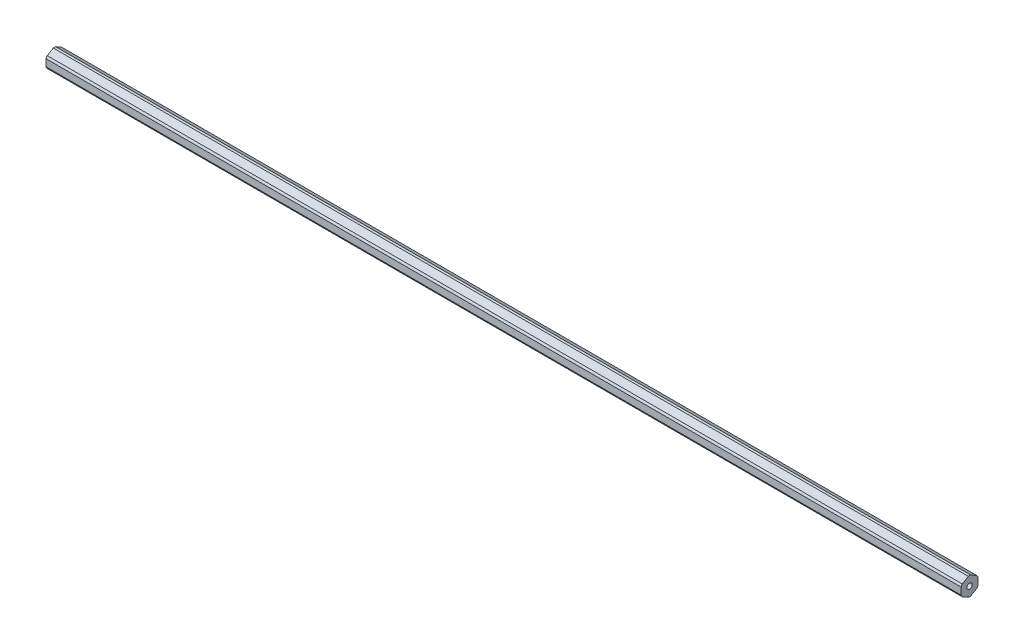
ISO-10303-21;
HEADER;
FILE_DESCRIPTION(('STEP AP214'),'2;1');
FILE_NAME('part.step','',(''),(''),'','','');
FILE_SCHEMA(('AUTOMOTIVE_DESIGN { 1 0 10303 214 1 1 1 1 }'));
ENDSEC;
DATA;
#1=APPLICATION_CONTEXT('core data for automotive mechanical design processes');
#2=APPLICATION_PROTOCOL_DEFINITION('international standard','automotive_design',2000,#1);
#3=PRODUCT_CONTEXT('',#1,'mechanical');
#4=PRODUCT('Part','Part','',(#3));
#5=PRODUCT_RELATED_PRODUCT_CATEGORY('part','',(#4));
#6=PRODUCT_DEFINITION_FORMATION('','',#4);
#7=PRODUCT_DEFINITION_CONTEXT('part definition',#1,'design');
#8=PRODUCT_DEFINITION('design','',#6,#7);
#9=PRODUCT_DEFINITION_SHAPE('','',#8);
#10=(LENGTH_UNIT() NAMED_UNIT(*) SI_UNIT(.MILLI.,.METRE.));
#11=(NAMED_UNIT(*) PLANE_ANGLE_UNIT() SI_UNIT($,.RADIAN.));
#12=(NAMED_UNIT(*) SI_UNIT($,.STERADIAN.) SOLID_ANGLE_UNIT());
#13=UNCERTAINTY_MEASURE_WITH_UNIT(LENGTH_MEASURE(1.E-05),#10,'distance_accuracy_value','');
#14=(GEOMETRIC_REPRESENTATION_CONTEXT(3) GLOBAL_UNCERTAINTY_ASSIGNED_CONTEXT((#13)) GLOBAL_UNIT_ASSIGNED_CONTEXT((#10,
#11,#12)) REPRESENTATION_CONTEXT('',''));
#15=CARTESIAN_POINT('',(0.,0.,0.));
#16=DIRECTION('',(0.,0.,1.));
#17=DIRECTION('',(1.,0.,0.));
#18=AXIS2_PLACEMENT_3D('',#15,#16,#17);
#19=CARTESIAN_POINT('',(342.9,-42.7410300776049,511.175273482722));
#20=DIRECTION('',(0.,-0.866025403784439,0.5));
#21=DIRECTION('',(0.,-0.5,-0.866025403784439));
#22=AXIS2_PLACEMENT_3D('',#19,#20,#21);
#23=PLANE('',#22);
#24=DIRECTION('',(0.,0.5,0.866025403784439));
#25=VECTOR('',#24,1.);
#26=CARTESIAN_POINT('',(342.9,-42.7410300776049,511.175273482722));
#27=LINE('',#26,#25);
#28=CARTESIAN_POINT('',(342.9,-44.0578613347996,508.894454840266));
#29=VERTEX_POINT('',#28);
#30=CARTESIAN_POINT('',(342.9,-41.4241988204102,513.456092125178));
#31=VERTEX_POINT('',#30);
#32=EDGE_CURVE('E192',#29,#31,#27,.T.);
#33=ORIENTED_EDGE('',*,*,#32,.T.);
#34=DIRECTION('',(-1.,0.,0.));
#35=VECTOR('',#34,1.);
#36=CARTESIAN_POINT('',(342.9,-41.4241988204102,513.456092125178));
#37=LINE('',#36,#35);
#38=CARTESIAN_POINT('',(-342.9,-41.42419882041,513.456092125178));
#39=VERTEX_POINT('',#38);
#40=EDGE_CURVE('E185',#31,#39,#37,.T.);
#41=ORIENTED_EDGE('',*,*,#40,.T.);
#42=DIRECTION('',(0.,-0.5,-0.866025403784438));
#43=VECTOR('',#42,1.);
#44=CARTESIAN_POINT('',(-342.9,-42.7410300776047,511.175273482722));
#45=LINE('',#44,#43);
#46=CARTESIAN_POINT('',(-342.9,-44.0578613347994,508.894454840266));
#47=VERTEX_POINT('',#46);
#48=EDGE_CURVE('E139',#39,#47,#45,.T.);
#49=ORIENTED_EDGE('',*,*,#48,.T.);
#50=DIRECTION('',(-1.,0.,0.));
#51=VECTOR('',#50,1.);
#52=CARTESIAN_POINT('',(342.9,-44.0578613347996,508.894454840266));
#53=LINE('',#52,#51);
#54=EDGE_CURVE('E181',#47,#29,#53,.F.);
#55=ORIENTED_EDGE('',*,*,#54,.T.);
#56=EDGE_LOOP('',(#33,#41,#49,#55));
#57=FACE_BOUND('',#56,.T.);
#58=ADVANCED_FACE('F17',(#57),#23,.T.);
#59=CARTESIAN_POINT('',(342.9,-37.2412950776049,514.350546965443));
#60=DIRECTION('',(0.,0.,1.));
#61=DIRECTION('',(1.,0.,0.));
#62=AXIS2_PLACEMENT_3D('',#59,#60,#61);
#63=PLANE('',#62);
#64=DIRECTION('',(0.,1.,0.));
#65=VECTOR('',#64,1.);
#66=CARTESIAN_POINT('',(342.9,-37.2412950776049,514.350546965443));
#67=LINE('',#66,#65);
#68=CARTESIAN_POINT('',(342.9,-39.8749575919942,514.350546965443));
#69=VERTEX_POINT('',#68);
#70=CARTESIAN_POINT('',(342.9,-34.6076325632155,514.350546965443));
#71=VERTEX_POINT('',#70);
#72=EDGE_CURVE('E196',#69,#71,#67,.T.);
#73=ORIENTED_EDGE('',*,*,#72,.T.);
#74=DIRECTION('',(-1.,0.,0.));
#75=VECTOR('',#74,1.);
#76=CARTESIAN_POINT('',(342.9,-34.6076325632155,514.350546965443));
#77=LINE('',#76,#75);
#78=CARTESIAN_POINT('',(-342.9,-34.6076325632153,514.350546965443));
#79=VERTEX_POINT('',#78);
#80=EDGE_CURVE('E178',#71,#79,#77,.T.);
#81=ORIENTED_EDGE('',*,*,#80,.T.);
#82=DIRECTION('',(0.,-1.,0.));
#83=VECTOR('',#82,1.);
#84=CARTESIAN_POINT('',(-342.9,-37.2412950776047,514.350546965443));
#85=LINE('',#84,#83);
#86=CARTESIAN_POINT('',(-342.9,-39.8749575919941,514.350546965443));
#87=VERTEX_POINT('',#86);
#88=EDGE_CURVE('E124',#79,#87,#85,.T.);
#89=ORIENTED_EDGE('',*,*,#88,.T.);
#90=DIRECTION('',(-1.,0.,0.));
#91=VECTOR('',#90,1.);
#92=CARTESIAN_POINT('',(342.9,-39.8749575919942,514.350546965443));
#93=LINE('',#92,#91);
#94=EDGE_CURVE('E175',#87,#69,#93,.F.);
#95=ORIENTED_EDGE('',*,*,#94,.T.);
#96=EDGE_LOOP('',(#73,#81,#89,#95));
#97=FACE_BOUND('',#96,.T.);
#98=ADVANCED_FACE('F256',(#97),#63,.T.);
#99=CARTESIAN_POINT('',(342.9,-31.7415600776049,511.175273482722));
#100=DIRECTION('',(0.,0.866025403784439,0.5));
#101=DIRECTION('',(0.,-0.5,0.866025403784439));
#102=AXIS2_PLACEMENT_3D('',#99,#100,#101);
#103=PLANE('',#102);
#104=DIRECTION('',(0.,0.5,-0.866025403784439));
#105=VECTOR('',#104,1.);
#106=CARTESIAN_POINT('',(342.9,-31.7415600776049,511.175273482722));
#107=LINE('',#106,#105);
#108=CARTESIAN_POINT('',(342.9,-33.0583913347996,513.456092125178));
#109=VERTEX_POINT('',#108);
#110=CARTESIAN_POINT('',(342.9,-30.4247288204101,508.894454840266));
#111=VERTEX_POINT('',#110);
#112=EDGE_CURVE('E200',#109,#111,#107,.T.);
#113=ORIENTED_EDGE('',*,*,#112,.T.);
#114=DIRECTION('',(-1.,0.,0.));
#115=VECTOR('',#114,1.);
#116=CARTESIAN_POINT('',(342.9,-30.4247288204101,508.894454840266));
#117=LINE('',#116,#115);
#118=CARTESIAN_POINT('',(-342.9,-30.42472882041,508.894454840266));
#119=VERTEX_POINT('',#118);
#120=EDGE_CURVE('E114',#111,#119,#117,.T.);
#121=ORIENTED_EDGE('',*,*,#120,.T.);
#122=DIRECTION('',(0.,-0.5,0.866025403784439));
#123=VECTOR('',#122,1.);
#124=CARTESIAN_POINT('',(-342.9,-31.7415600776047,511.175273482722));
#125=LINE('',#124,#123);
#126=CARTESIAN_POINT('',(-342.9,-33.0583913347993,513.456092125178));
#127=VERTEX_POINT('',#126);
#128=EDGE_CURVE('E121',#119,#127,#125,.T.);
#129=ORIENTED_EDGE('',*,*,#128,.T.);
#130=DIRECTION('',(-1.,0.,0.));
#131=VECTOR('',#130,1.);
#132=CARTESIAN_POINT('',(342.9,-33.0583913347996,513.456092125178));
#133=LINE('',#132,#131);
#134=EDGE_CURVE('E104',#127,#109,#133,.F.);
#135=ORIENTED_EDGE('',*,*,#134,.T.);
#136=EDGE_LOOP('',(#113,#121,#129,#135));
#137=FACE_BOUND('',#136,.T.);
#138=ADVANCED_FACE('F130',(#137),#103,.T.);
#139=CARTESIAN_POINT('',(342.9,-31.7415600776049,504.824726517279));
#140=DIRECTION('',(0.,0.866025403784439,-0.5));
#141=DIRECTION('',(0.,0.5,0.866025403784439));
#142=AXIS2_PLACEMENT_3D('',#139,#140,#141);
#143=PLANE('',#142);
#144=DIRECTION('',(0.,-0.5,-0.866025403784439));
#145=VECTOR('',#144,1.);
#146=CARTESIAN_POINT('',(342.9,-31.7415600776049,504.824726517279));
#147=LINE('',#146,#145);
#148=CARTESIAN_POINT('',(342.9,-30.4247288204101,507.105545159735));
#149=VERTEX_POINT('',#148);
#150=CARTESIAN_POINT('',(342.9,-33.0583913347996,502.543907874823));
#151=VERTEX_POINT('',#150);
#152=EDGE_CURVE('E203',#149,#151,#147,.T.);
#153=ORIENTED_EDGE('',*,*,#152,.T.);
#154=DIRECTION('',(-1.,0.,0.));
#155=VECTOR('',#154,1.);
#156=CARTESIAN_POINT('',(342.9,-33.0583913347996,502.543907874823));
#157=LINE('',#156,#155);
#158=CARTESIAN_POINT('',(-342.9,-33.0583913347994,502.543907874823));
#159=VERTEX_POINT('',#158);
#160=EDGE_CURVE('E115',#151,#159,#157,.T.);
#161=ORIENTED_EDGE('',*,*,#160,.T.);
#162=DIRECTION('',(0.,0.5,0.866025403784439));
#163=VECTOR('',#162,1.);
#164=CARTESIAN_POINT('',(-342.9,-31.7415600776047,504.824726517279));
#165=LINE('',#164,#163);
#166=CARTESIAN_POINT('',(-342.9,-30.42472882041,507.105545159735));
#167=VERTEX_POINT('',#166);
#168=EDGE_CURVE('E133',#159,#167,#165,.T.);
#169=ORIENTED_EDGE('',*,*,#168,.T.);
#170=DIRECTION('',(-1.,0.,0.));
#171=VECTOR('',#170,1.);
#172=CARTESIAN_POINT('',(342.9,-30.4247288204101,507.105545159735));
#173=LINE('',#172,#171);
#174=EDGE_CURVE('E168',#167,#149,#173,.F.);
#175=ORIENTED_EDGE('',*,*,#174,.T.);
#176=EDGE_LOOP('',(#153,#161,#169,#175));
#177=FACE_BOUND('',#176,.T.);
#178=ADVANCED_FACE('F253',(#177),#143,.T.);
#179=CARTESIAN_POINT('',(342.9,-37.2412950776049,501.649453034557));
#180=DIRECTION('',(0.,0.,-1.));
#181=DIRECTION('',(-1.,0.,0.));
#182=AXIS2_PLACEMENT_3D('',#179,#180,#181);
#183=PLANE('',#182);
#184=DIRECTION('',(0.,-1.,0.));
#185=VECTOR('',#184,1.);
#186=CARTESIAN_POINT('',(342.9,-37.2412950776049,501.649453034557));
#187=LINE('',#186,#185);
#188=CARTESIAN_POINT('',(342.9,-34.6076325632155,501.649453034557));
#189=VERTEX_POINT('',#188);
#190=CARTESIAN_POINT('',(342.9,-39.8749575919942,501.649453034557));
#191=VERTEX_POINT('',#190);
#192=EDGE_CURVE('E25',#189,#191,#187,.T.);
#193=ORIENTED_EDGE('',*,*,#192,.T.);
#194=DIRECTION('',(-1.,0.,0.));
#195=VECTOR('',#194,1.);
#196=CARTESIAN_POINT('',(342.9,-39.8749575919942,501.649453034557));
#197=LINE('',#196,#195);
#198=CARTESIAN_POINT('',(-342.9,-39.8749575919941,501.649453034557));
#199=VERTEX_POINT('',#198);
#200=EDGE_CURVE('E165',#191,#199,#197,.T.);
#201=ORIENTED_EDGE('',*,*,#200,.T.);
#202=DIRECTION('',(0.,1.,0.));
#203=VECTOR('',#202,1.);
#204=CARTESIAN_POINT('',(-342.9,-37.2412950776047,501.649453034557));
#205=LINE('',#204,#203);
#206=CARTESIAN_POINT('',(-342.9,-34.6076325632153,501.649453034557));
#207=VERTEX_POINT('',#206);
#208=EDGE_CURVE('E143',#199,#207,#205,.T.);
#209=ORIENTED_EDGE('',*,*,#208,.T.);
#210=DIRECTION('',(-1.,0.,0.));
#211=VECTOR('',#210,1.);
#212=CARTESIAN_POINT('',(342.9,-34.6076325632155,501.649453034557));
#213=LINE('',#212,#211);
#214=EDGE_CURVE('E161',#207,#189,#213,.F.);
#215=ORIENTED_EDGE('',*,*,#214,.T.);
#216=EDGE_LOOP('',(#193,#201,#209,#215));
#217=FACE_BOUND('',#216,.T.);
#218=ADVANCED_FACE('F210',(#217),#183,.T.);
#219=CARTESIAN_POINT('',(342.9,-42.7410300776049,504.824726517279));
#220=DIRECTION('',(0.,-0.866025403784438,-0.5));
#221=DIRECTION('',(0.,0.5,-0.866025403784438));
#222=AXIS2_PLACEMENT_3D('',#219,#220,#221);
#223=PLANE('',#222);
#224=DIRECTION('',(0.,-0.5,0.866025403784438));
#225=VECTOR('',#224,1.);
#226=CARTESIAN_POINT('',(342.9,-42.7410300776049,504.824726517279));
#227=LINE('',#226,#225);
#228=CARTESIAN_POINT('',(342.9,-41.4241988204102,502.543907874823));
#229=VERTEX_POINT('',#228);
#230=CARTESIAN_POINT('',(342.9,-44.0578613347996,507.105545159735));
#231=VERTEX_POINT('',#230);
#232=EDGE_CURVE('E11',#229,#231,#227,.T.);
#233=ORIENTED_EDGE('',*,*,#232,.T.);
#234=DIRECTION('',(-1.,0.,0.));
#235=VECTOR('',#234,1.);
#236=CARTESIAN_POINT('',(342.9,-44.0578613347996,507.105545159735));
#237=LINE('',#236,#235);
#238=CARTESIAN_POINT('',(-342.9,-44.0578613347994,507.105545159735));
#239=VERTEX_POINT('',#238);
#240=EDGE_CURVE('E158',#231,#239,#237,.T.);
#241=ORIENTED_EDGE('',*,*,#240,.T.);
#242=DIRECTION('',(0.,0.5,-0.866025403784439));
#243=VECTOR('',#242,1.);
#244=CARTESIAN_POINT('',(-342.9,-42.7410300776047,504.824726517279));
#245=LINE('',#244,#243);
#246=CARTESIAN_POINT('',(-342.9,-41.42419882041,502.543907874823));
#247=VERTEX_POINT('',#246);
#248=EDGE_CURVE('E242',#239,#247,#245,.T.);
#249=ORIENTED_EDGE('',*,*,#248,.T.);
#250=DIRECTION('',(-1.,0.,0.));
#251=VECTOR('',#250,1.);
#252=CARTESIAN_POINT('',(342.9,-41.4241988204102,502.543907874823));
#253=LINE('',#252,#251);
#254=EDGE_CURVE('E154',#247,#229,#253,.F.);
#255=ORIENTED_EDGE('',*,*,#254,.T.);
#256=EDGE_LOOP('',(#233,#241,#249,#255));
#257=FACE_BOUND('',#256,.T.);
#258=ADVANCED_FACE('F268',(#257),#223,.T.);
#259=CARTESIAN_POINT('',(342.9,-37.2412950776049,508.));
#260=DIRECTION('',(-1.,0.,0.));
#261=DIRECTION('',(0.,-1.,0.));
#262=AXIS2_PLACEMENT_3D('',#259,#260,#261);
#263=PLANE('',#262);
#264=CARTESIAN_POINT('',(342.9,-37.2412950776049,508.));
#265=DIRECTION('',(-1.,0.,0.));
#266=DIRECTION('',(0.,-1.,0.));
#267=AXIS2_PLACEMENT_3D('',#264,#265,#266);
#268=CIRCLE('',#267,2.);
#269=CARTESIAN_POINT('',(342.9,-39.2412950776049,508.));
#270=VERTEX_POINT('',#269);
#271=EDGE_CURVE('E188',#270,#270,#268,.T.);
#272=ORIENTED_EDGE('',*,*,#271,.T.);
#273=EDGE_LOOP('',(#272));
#274=FACE_BOUND('',#273,.T.);
#275=CARTESIAN_POINT('',(342.9,-37.2412950776049,508.));
#276=DIRECTION('',(-1.,0.,0.));
#277=DIRECTION('',(0.,-1.,0.));
#278=AXIS2_PLACEMENT_3D('',#275,#276,#277);
#279=CIRCLE('',#278,6.875);
#280=EDGE_CURVE('E32',#31,#69,#279,.T.);
#281=ORIENTED_EDGE('',*,*,#280,.F.);
#282=ORIENTED_EDGE('',*,*,#32,.F.);
#283=EDGE_CURVE('E150',#231,#29,#279,.T.);
#284=ORIENTED_EDGE('',*,*,#283,.F.);
#285=ORIENTED_EDGE('',*,*,#232,.F.);
#286=EDGE_CURVE('E153',#191,#229,#279,.T.);
#287=ORIENTED_EDGE('',*,*,#286,.F.);
#288=ORIENTED_EDGE('',*,*,#192,.F.);
#289=EDGE_CURVE('E218',#151,#189,#279,.T.);
#290=ORIENTED_EDGE('',*,*,#289,.F.);
#291=ORIENTED_EDGE('',*,*,#152,.F.);
#292=EDGE_CURVE('E225',#111,#149,#279,.T.);
#293=ORIENTED_EDGE('',*,*,#292,.F.);
#294=ORIENTED_EDGE('',*,*,#112,.F.);
#295=EDGE_CURVE('E40',#71,#109,#279,.T.);
#296=ORIENTED_EDGE('',*,*,#295,.F.);
#297=ORIENTED_EDGE('',*,*,#72,.F.);
#298=EDGE_LOOP('',(#281,#282,#284,#285,#287,#288,#290,#291,#293,#294,#296,#297));
#299=FACE_BOUND('',#298,.T.);
#300=ADVANCED_FACE('F216',(#274,#299),#263,.F.);
#301=CARTESIAN_POINT('',(342.9,-37.2412950776049,508.));
#302=DIRECTION('',(-1.,0.,0.));
#303=DIRECTION('',(0.,-1.,0.));
#304=AXIS2_PLACEMENT_3D('',#301,#302,#303);
#305=CYLINDRICAL_SURFACE('',#304,2.);
#306=ORIENTED_EDGE('',*,*,#271,.F.);
#307=EDGE_LOOP('',(#306));
#308=FACE_BOUND('',#307,.T.);
#309=CARTESIAN_POINT('',(-342.9,-37.2412950776047,508.));
#310=DIRECTION('',(1.,0.,0.));
#311=DIRECTION('',(0.,1.,0.));
#312=AXIS2_PLACEMENT_3D('',#309,#310,#311);
#313=CIRCLE('',#312,2.);
#314=CARTESIAN_POINT('',(-342.9,-35.2412950776047,508.));
#315=VERTEX_POINT('',#314);
#316=EDGE_CURVE('E126',#315,#315,#313,.T.);
#317=ORIENTED_EDGE('',*,*,#316,.F.);
#318=EDGE_LOOP('',(#317));
#319=FACE_BOUND('',#318,.T.);
#320=ADVANCED_FACE('F279',(#308,#319),#305,.F.);
#321=CARTESIAN_POINT('',(342.9,-37.2412950776049,508.));
#322=DIRECTION('',(-1.,0.,0.));
#323=DIRECTION('',(0.,-1.,0.));
#324=AXIS2_PLACEMENT_3D('',#321,#322,#323);
#325=CYLINDRICAL_SURFACE('',#324,6.875);
#326=ORIENTED_EDGE('',*,*,#286,.T.);
#327=ORIENTED_EDGE('',*,*,#254,.F.);
#328=CARTESIAN_POINT('',(-342.9,-37.2412950776047,508.));
#329=DIRECTION('',(1.,0.,0.));
#330=DIRECTION('',(0.,1.,0.));
#331=AXIS2_PLACEMENT_3D('',#328,#329,#330);
#332=CIRCLE('',#331,6.875);
#333=EDGE_CURVE('E237',#247,#199,#332,.T.);
#334=ORIENTED_EDGE('',*,*,#333,.T.);
#335=ORIENTED_EDGE('',*,*,#200,.F.);
#336=EDGE_LOOP('',(#326,#327,#334,#335));
#337=FACE_BOUND('',#336,.T.);
#338=ADVANCED_FACE('F266',(#337),#325,.T.);
#339=ORIENTED_EDGE('',*,*,#54,.F.);
#340=EDGE_CURVE('E262',#47,#239,#332,.T.);
#341=ORIENTED_EDGE('',*,*,#340,.T.);
#342=ORIENTED_EDGE('',*,*,#240,.F.);
#343=ORIENTED_EDGE('',*,*,#283,.T.);
#344=EDGE_LOOP('',(#339,#341,#342,#343));
#345=FACE_BOUND('',#344,.T.);
#346=ADVANCED_FACE('F271',(#345),#325,.T.);
#347=ORIENTED_EDGE('',*,*,#289,.T.);
#348=ORIENTED_EDGE('',*,*,#214,.F.);
#349=EDGE_CURVE('E234',#207,#159,#332,.T.);
#350=ORIENTED_EDGE('',*,*,#349,.T.);
#351=ORIENTED_EDGE('',*,*,#160,.F.);
#352=EDGE_LOOP('',(#347,#348,#350,#351));
#353=FACE_BOUND('',#352,.T.);
#354=ADVANCED_FACE('F251',(#353),#325,.T.);
#355=ORIENTED_EDGE('',*,*,#292,.T.);
#356=ORIENTED_EDGE('',*,*,#174,.F.);
#357=EDGE_CURVE('E129',#167,#119,#332,.T.);
#358=ORIENTED_EDGE('',*,*,#357,.T.);
#359=ORIENTED_EDGE('',*,*,#120,.F.);
#360=EDGE_LOOP('',(#355,#356,#358,#359));
#361=FACE_BOUND('',#360,.T.);
#362=ADVANCED_FACE('F278',(#361),#325,.T.);
#363=ORIENTED_EDGE('',*,*,#295,.T.);
#364=ORIENTED_EDGE('',*,*,#134,.F.);
#365=EDGE_CURVE('E107',#127,#79,#332,.T.);
#366=ORIENTED_EDGE('',*,*,#365,.T.);
#367=ORIENTED_EDGE('',*,*,#80,.F.);
#368=EDGE_LOOP('',(#363,#364,#366,#367));
#369=FACE_BOUND('',#368,.T.);
#370=ADVANCED_FACE('F106',(#369),#325,.T.);
#371=ORIENTED_EDGE('',*,*,#280,.T.);
#372=ORIENTED_EDGE('',*,*,#94,.F.);
#373=EDGE_CURVE('E127',#87,#39,#332,.T.);
#374=ORIENTED_EDGE('',*,*,#373,.T.);
#375=ORIENTED_EDGE('',*,*,#40,.F.);
#376=EDGE_LOOP('',(#371,#372,#374,#375));
#377=FACE_BOUND('',#376,.T.);
#378=ADVANCED_FACE('F258',(#377),#325,.T.);
#379=CARTESIAN_POINT('',(-342.9,-37.2412950776047,508.));
#380=DIRECTION('',(1.,0.,0.));
#381=DIRECTION('',(0.,-1.,0.));
#382=AXIS2_PLACEMENT_3D('',#379,#380,#381);
#383=PLANE('',#382);
#384=ORIENTED_EDGE('',*,*,#316,.T.);
#385=EDGE_LOOP('',(#384));
#386=FACE_BOUND('',#385,.T.);
#387=ORIENTED_EDGE('',*,*,#365,.F.);
#388=ORIENTED_EDGE('',*,*,#128,.F.);
#389=ORIENTED_EDGE('',*,*,#357,.F.);
#390=ORIENTED_EDGE('',*,*,#168,.F.);
#391=ORIENTED_EDGE('',*,*,#349,.F.);
#392=ORIENTED_EDGE('',*,*,#208,.F.);
#393=ORIENTED_EDGE('',*,*,#333,.F.);
#394=ORIENTED_EDGE('',*,*,#248,.F.);
#395=ORIENTED_EDGE('',*,*,#340,.F.);
#396=ORIENTED_EDGE('',*,*,#48,.F.);
#397=ORIENTED_EDGE('',*,*,#373,.F.);
#398=ORIENTED_EDGE('',*,*,#88,.F.);
#399=EDGE_LOOP('',(#387,#388,#389,#390,#391,#392,#393,#394,#395,#396,#397,#398));
#400=FACE_BOUND('',#399,.T.);
#401=ADVANCED_FACE('F119',(#386,#400),#383,.F.);
#402=CLOSED_SHELL('',(#58,#98,#138,#178,#218,#258,#300,#320,#338,#346,#354,#362,#370,#378,#401));
#403=MANIFOLD_SOLID_BREP('B1',#402);
#404=ADVANCED_BREP_SHAPE_REPRESENTATION('',(#18,#403),#14);
#405=SHAPE_DEFINITION_REPRESENTATION(#9,#404);
ENDSEC;
END-ISO-10303-21;
